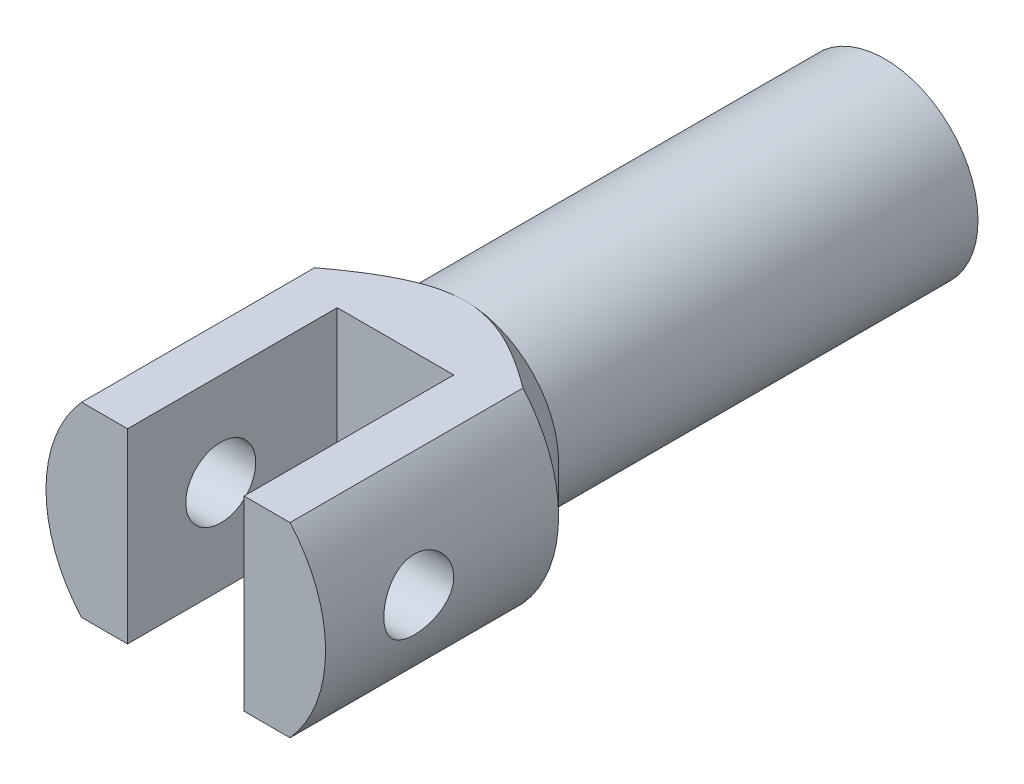
ISO-10303-21;
HEADER;
FILE_DESCRIPTION(('STEP AP214'),'2;1');
FILE_NAME('part.step','',(''),(''),'','','');
FILE_SCHEMA(('AUTOMOTIVE_DESIGN { 1 0 10303 214 1 1 1 1 }'));
ENDSEC;
DATA;
#1=APPLICATION_CONTEXT('core data for automotive mechanical design processes');
#2=APPLICATION_PROTOCOL_DEFINITION('international standard','automotive_design',2000,#1);
#3=PRODUCT_CONTEXT('',#1,'mechanical');
#4=PRODUCT('Part','Part','',(#3));
#5=PRODUCT_RELATED_PRODUCT_CATEGORY('part','',(#4));
#6=PRODUCT_DEFINITION_FORMATION('','',#4);
#7=PRODUCT_DEFINITION_CONTEXT('part definition',#1,'design');
#8=PRODUCT_DEFINITION('design','',#6,#7);
#9=PRODUCT_DEFINITION_SHAPE('','',#8);
#10=(LENGTH_UNIT() NAMED_UNIT(*) SI_UNIT(.MILLI.,.METRE.));
#11=(NAMED_UNIT(*) PLANE_ANGLE_UNIT() SI_UNIT($,.RADIAN.));
#12=(NAMED_UNIT(*) SI_UNIT($,.STERADIAN.) SOLID_ANGLE_UNIT());
#13=UNCERTAINTY_MEASURE_WITH_UNIT(LENGTH_MEASURE(1.E-05),#10,'distance_accuracy_value','');
#14=(GEOMETRIC_REPRESENTATION_CONTEXT(3) GLOBAL_UNCERTAINTY_ASSIGNED_CONTEXT((#13)) GLOBAL_UNIT_ASSIGNED_CONTEXT((#10,
#11,#12)) REPRESENTATION_CONTEXT('',''));
#15=CARTESIAN_POINT('',(0.,0.,0.));
#16=DIRECTION('',(0.,0.,1.));
#17=DIRECTION('',(1.,0.,0.));
#18=AXIS2_PLACEMENT_3D('',#15,#16,#17);
#19=CARTESIAN_POINT('',(0.,0.,30.));
#20=DIRECTION('',(0.,0.,1.));
#21=DIRECTION('',(1.,0.,0.));
#22=AXIS2_PLACEMENT_3D('',#19,#20,#21);
#23=PLANE('',#22);
#24=DIRECTION('',(-1.,0.,0.));
#25=VECTOR('',#24,1.);
#26=CARTESIAN_POINT('',(-4.47213595499958,4.,30.));
#27=LINE('',#26,#25);
#28=CARTESIAN_POINT('',(4.47213595499958,4.,30.));
#29=VERTEX_POINT('',#28);
#30=CARTESIAN_POINT('',(2.5,4.,30.));
#31=VERTEX_POINT('',#30);
#32=EDGE_CURVE('E181',#29,#31,#27,.T.);
#33=ORIENTED_EDGE('',*,*,#32,.T.);
#34=DIRECTION('',(0.,-1.,0.));
#35=VECTOR('',#34,1.);
#36=CARTESIAN_POINT('',(2.5,0.,30.));
#37=LINE('',#36,#35);
#38=CARTESIAN_POINT('',(2.5,-4.,30.));
#39=VERTEX_POINT('',#38);
#40=EDGE_CURVE('E274',#31,#39,#37,.T.);
#41=ORIENTED_EDGE('',*,*,#40,.T.);
#42=DIRECTION('',(1.,0.,0.));
#43=VECTOR('',#42,1.);
#44=CARTESIAN_POINT('',(-4.47213595499958,-4.,30.));
#45=LINE('',#44,#43);
#46=CARTESIAN_POINT('',(4.47213595499958,-4.,30.));
#47=VERTEX_POINT('',#46);
#48=EDGE_CURVE('E188',#39,#47,#45,.T.);
#49=ORIENTED_EDGE('',*,*,#48,.T.);
#50=CARTESIAN_POINT('',(0.,0.,30.));
#51=DIRECTION('',(0.,0.,1.));
#52=DIRECTION('',(1.,0.,0.));
#53=AXIS2_PLACEMENT_3D('',#50,#51,#52);
#54=CIRCLE('',#53,6.);
#55=EDGE_CURVE('E175',#47,#29,#54,.T.);
#56=ORIENTED_EDGE('',*,*,#55,.T.);
#57=EDGE_LOOP('',(#33,#41,#49,#56));
#58=FACE_BOUND('',#57,.T.);
#59=ADVANCED_FACE('F40',(#58),#23,.T.);
#60=CARTESIAN_POINT('',(0.,0.,20.));
#61=DIRECTION('',(0.,0.,-1.));
#62=DIRECTION('',(-1.,0.,0.));
#63=AXIS2_PLACEMENT_3D('',#60,#61,#62);
#64=CYLINDRICAL_SURFACE('',#63,4.);
#65=CARTESIAN_POINT('',(0.,0.,18.));
#66=DIRECTION('',(0.,0.,1.));
#67=DIRECTION('',(1.,0.,0.));
#68=AXIS2_PLACEMENT_3D('',#65,#66,#67);
#69=CIRCLE('',#68,4.);
#70=CARTESIAN_POINT('',(0.,4.,18.));
#71=VERTEX_POINT('',#70);
#72=CARTESIAN_POINT('',(0.,-4.,18.));
#73=VERTEX_POINT('',#72);
#74=EDGE_CURVE('E67',#71,#73,#69,.F.);
#75=ORIENTED_EDGE('',*,*,#74,.T.);
#76=CARTESIAN_POINT('',(0.,0.,18.));
#77=DIRECTION('',(0.,0.,1.));
#78=DIRECTION('',(1.,0.,0.));
#79=AXIS2_PLACEMENT_3D('',#76,#77,#78);
#80=CIRCLE('',#79,4.);
#81=EDGE_CURVE('E219',#73,#71,#80,.F.);
#82=ORIENTED_EDGE('',*,*,#81,.T.);
#83=EDGE_LOOP('',(#75,#82));
#84=FACE_BOUND('',#83,.T.);
#85=CARTESIAN_POINT('',(0.,0.,0.));
#86=DIRECTION('',(0.,0.,1.));
#87=DIRECTION('',(1.,0.,0.));
#88=AXIS2_PLACEMENT_3D('',#85,#86,#87);
#89=CIRCLE('',#88,4.);
#90=CARTESIAN_POINT('',(4.,0.,0.));
#91=VERTEX_POINT('',#90);
#92=EDGE_CURVE('E213',#91,#91,#89,.T.);
#93=ORIENTED_EDGE('',*,*,#92,.T.);
#94=EDGE_LOOP('',(#93));
#95=FACE_BOUND('',#94,.T.);
#96=ADVANCED_FACE('F244',(#84,#95),#64,.T.);
#97=CARTESIAN_POINT('',(0.,0.,0.));
#98=DIRECTION('',(0.,0.,1.));
#99=DIRECTION('',(1.,0.,0.));
#100=AXIS2_PLACEMENT_3D('',#97,#98,#99);
#101=PLANE('',#100);
#102=CARTESIAN_POINT('',(0.,0.,0.));
#103=DIRECTION('',(0.,0.,-1.));
#104=DIRECTION('',(-1.,0.,0.));
#105=AXIS2_PLACEMENT_3D('',#102,#103,#104);
#106=CIRCLE('',#105,1.99999999999999);
#107=CARTESIAN_POINT('',(-1.99999999999999,0.,0.));
#108=VERTEX_POINT('',#107);
#109=EDGE_CURVE('E303',#108,#108,#106,.T.);
#110=ORIENTED_EDGE('',*,*,#109,.F.);
#111=EDGE_LOOP('',(#110));
#112=FACE_BOUND('',#111,.T.);
#113=ORIENTED_EDGE('',*,*,#92,.F.);
#114=EDGE_LOOP('',(#113));
#115=FACE_BOUND('',#114,.T.);
#116=ADVANCED_FACE('F248',(#112,#115),#101,.F.);
#117=CARTESIAN_POINT('',(0.,0.,30.));
#118=DIRECTION('',(0.,0.,-1.));
#119=DIRECTION('',(-1.,0.,0.));
#120=AXIS2_PLACEMENT_3D('',#117,#118,#119);
#121=CYLINDRICAL_SURFACE('',#120,6.);
#122=CARTESIAN_POINT('',(6.,0.,27.5));
#123=CARTESIAN_POINT('',(5.99999859868013,0.0828760886697307,27.4999976742618));
#124=CARTESIAN_POINT('',(5.99826578131828,0.165778157830762,27.4931084492262));
#125=CARTESIAN_POINT('',(5.99152113829892,0.329206323770531,27.465774848693));
#126=CARTESIAN_POINT('',(5.98650745419968,0.409731046870738,27.4453227904621));
#127=CARTESIAN_POINT('',(5.9737562633204,0.566020872182575,27.3915607465379));
#128=CARTESIAN_POINT('',(5.96602202842087,0.641791563430001,27.3582662012847));
#129=CARTESIAN_POINT('',(5.94865343807593,0.786672131904423,27.2798186099552));
#130=CARTESIAN_POINT('',(5.9390190185405,0.855781784348756,27.2346651638811));
#131=CARTESIAN_POINT('',(5.91867413591801,0.986801927300917,27.1327992103458));
#132=CARTESIAN_POINT('',(5.90794707148533,1.04855569006107,27.0758884250408));
#133=CARTESIAN_POINT('',(5.8867362011753,1.1617489272033,26.9525477950911));
#134=CARTESIAN_POINT('',(5.87625242288348,1.21318723694913,26.8861168770535));
#135=CARTESIAN_POINT('',(5.8565477569971,1.30502654279903,26.7444047732626));
#136=CARTESIAN_POINT('',(5.84734794470605,1.34525221592535,26.6690067691896));
#137=CARTESIAN_POINT('',(5.83149494812223,1.41239690855052,26.5122515883416));
#138=CARTESIAN_POINT('',(5.82484135672789,1.43931805543933,26.4308953666742));
#139=CARTESIAN_POINT('',(5.81500476717551,1.47855483680428,26.2662565017975));
#140=CARTESIAN_POINT('',(5.81175491075426,1.49115226833333,26.1830451039502));
#141=CARTESIAN_POINT('',(5.80889362537741,1.50226177506785,26.015631430986));
#142=CARTESIAN_POINT('',(5.80928160448644,1.50077614181797,25.9314293193014));
#143=CARTESIAN_POINT('',(5.81359205496618,1.48398652463927,25.7665841922555));
#144=CARTESIAN_POINT('',(5.81742863001879,1.46901834019051,25.6859043785349));
#145=CARTESIAN_POINT('',(5.82806709676484,1.4262241869031,25.5282389490887));
#146=CARTESIAN_POINT('',(5.83486919970697,1.39839730206942,25.451253596971));
#147=CARTESIAN_POINT('',(5.85075113904187,1.33038947793715,25.3022619837479));
#148=CARTESIAN_POINT('',(5.85985327469421,1.29008666723291,25.2303138282104));
#149=CARTESIAN_POINT('',(5.87929710846386,1.19835627601495,25.0940812902432));
#150=CARTESIAN_POINT('',(5.88963902334735,1.14692674880883,25.0297982519327));
#151=CARTESIAN_POINT('',(5.91075880539781,1.03266342468121,24.9087963843056));
#152=CARTESIAN_POINT('',(5.92154069477971,0.969546258165857,24.8523455099387));
#153=CARTESIAN_POINT('',(5.94205965578786,0.834611917503699,24.7507787575361));
#154=CARTESIAN_POINT('',(5.95179669549415,0.762794477707943,24.7056632257364));
#155=CARTESIAN_POINT('',(5.96917732094182,0.612115888681392,24.6279494137756));
#156=CARTESIAN_POINT('',(5.97681360127725,0.533231393208624,24.5953946597456));
#157=CARTESIAN_POINT('',(5.98907916991419,0.370876008142883,24.5440826942904));
#158=CARTESIAN_POINT('',(5.99370903339281,0.287405999150484,24.5253228435819));
#159=CARTESIAN_POINT('',(5.99935499271375,0.120539970390026,24.5025424344412));
#160=CARTESIAN_POINT('',(6.00046053508279,0.0371967199882093,24.4981569739247));
#161=CARTESIAN_POINT('',(5.99918804814451,-0.129032874801508,24.5032490020555));
#162=CARTESIAN_POINT('',(5.99681033241846,-0.211919259644595,24.5127252427991));
#163=CARTESIAN_POINT('',(5.98889581127357,-0.373614268776491,24.5449709083914));
#164=CARTESIAN_POINT('',(5.98340634185811,-0.452465118968754,24.567541263477));
#165=CARTESIAN_POINT('',(5.96988706634134,-0.605257292452509,24.6251070840285));
#166=CARTESIAN_POINT('',(5.96185700369892,-0.679198119032632,24.6601038043132));
#167=CARTESIAN_POINT('',(5.9439330792631,-0.821523134429844,24.7422361288747));
#168=CARTESIAN_POINT('',(5.93400867366932,-0.889785441835827,24.7895761123968));
#169=CARTESIAN_POINT('',(5.91344509187419,-1.01752661364324,24.894789908797));
#170=CARTESIAN_POINT('',(5.90280579251705,-1.077003958973,24.9526655396169));
#171=CARTESIAN_POINT('',(5.88168956960771,-1.18699056807273,25.0790019608445));
#172=CARTESIAN_POINT('',(5.87122304187281,-1.23724386762203,25.1476877030024));
#173=CARTESIAN_POINT('',(5.85192878377239,-1.32551075901269,25.2927326344657));
#174=CARTESIAN_POINT('',(5.84310098067026,-1.36352489415793,25.3690914829598));
#175=CARTESIAN_POINT('',(5.82818094734665,-1.42595142060929,25.5269057224131));
#176=CARTESIAN_POINT('',(5.82207255291906,-1.45044439665406,25.608327628344));
#177=CARTESIAN_POINT('',(5.81326744090184,-1.48534565995377,25.7743096378891));
#178=CARTESIAN_POINT('',(5.81056997719936,-1.49575702747865,25.8588690510325));
#179=CARTESIAN_POINT('',(5.80894901203957,-1.50203859033399,26.0261210238552));
#180=CARTESIAN_POINT('',(5.80991932728264,-1.49831789778011,26.1087974351247));
#181=CARTESIAN_POINT('',(5.81527909007843,-1.47737727831286,26.272303888668));
#182=CARTESIAN_POINT('',(5.81966846891857,-1.46015762268676,26.3531339680136));
#183=CARTESIAN_POINT('',(5.83131260682723,-1.41293131944279,26.5102084590654));
#184=CARTESIAN_POINT('',(5.8385501523631,-1.38300140468037,26.5864773052402));
#185=CARTESIAN_POINT('',(5.85507755724829,-1.31126491360507,26.7329653827137));
#186=CARTESIAN_POINT('',(5.86436770120773,-1.26945669003418,26.8031837731869));
#187=CARTESIAN_POINT('',(5.88425634263512,-1.17386774863713,26.937554629002));
#188=CARTESIAN_POINT('',(5.89488264831757,-1.11980316291225,27.001501073424));
#189=CARTESIAN_POINT('',(5.91608027246286,-1.00178937118973,27.1195470447954));
#190=CARTESIAN_POINT('',(5.9266515772706,-0.937837821261141,27.173644230113));
#191=CARTESIAN_POINT('',(5.94677655647663,-0.800467586702586,27.2714113085646));
#192=CARTESIAN_POINT('',(5.95630833365868,-0.726898422316383,27.3148746136716));
#193=CARTESIAN_POINT('',(5.97304924975118,-0.573266059510474,27.3887474629405));
#194=CARTESIAN_POINT('',(5.98026005199781,-0.493207563436737,27.4191663606485));
#195=CARTESIAN_POINT('',(5.99048059565542,-0.34441025324347,27.4615718303296));
#196=CARTESIAN_POINT('',(5.99402585052691,-0.276380170908067,27.4759512430534));
#197=CARTESIAN_POINT('',(5.99878605231948,-0.138906071536282,27.4951659436219));
#198=CARTESIAN_POINT('',(6.00000117450894,-0.0694621612426158,27.5000019493053));
#199=CARTESIAN_POINT('',(6.,0.,27.5));
#200=B_SPLINE_CURVE_WITH_KNOTS('',3,(#122,#123,#124,#125,#126,#127,#128,#129,#130,#131,#132,
#133,#134,#135,#136,#137,#138,#139,#140,#141,#142,#143,#144,#145,#146,#147,#148,#149,#150,#151,
#152,#153,#154,#155,#156,#157,#158,#159,#160,#161,#162,#163,#164,#165,#166,#167,#168,#169,#170,
#171,#172,#173,#174,#175,#176,#177,#178,#179,#180,#181,#182,#183,#184,#185,#186,#187,#188,#189,
#190,#191,#192,#193,#194,#195,#196,#197,#198,#199),.UNSPECIFIED.,.T.,.F.,(4,2,2,2,2,2,2,2,2,2,2,
2,2,2,2,2,2,2,2,2,2,2,2,2,2,2,2,2,2,2,2,2,2,2,2,2,2,2,4),(0.,0.248373712471889,
0.496888237763898,0.745104902286104,0.993329940169325,1.24614435437139,1.49898729580061,
1.75558647545806,2.01214461169368,2.2635629509943,2.51494038112695,2.76022497007016,
3.00552703466037,3.25330527873878,3.50112690836161,3.75601500969017,4.01091089558245,
4.26668229009112,4.52240473688641,4.77158308949274,5.02073901112741,5.26620274514035,
5.51169127322288,5.76153587565349,6.01142363008016,6.26744509204473,6.52345518749505,
6.77792254614033,7.03233423252405,7.2794378039861,7.52653640956031,7.77216400559443,
8.01782568136897,8.26989576409906,8.52202569770414,8.77872185499584,9.03523363821346,
9.24342242942145,9.45159556043035),.UNSPECIFIED.);
#201=CARTESIAN_POINT('',(6.,0.,27.5));
#202=VERTEX_POINT('',#201);
#203=EDGE_CURVE('E333',#202,#202,#200,.T.);
#204=ORIENTED_EDGE('',*,*,#203,.T.);
#205=EDGE_LOOP('',(#204));
#206=FACE_BOUND('',#205,.T.);
#207=CARTESIAN_POINT('',(0.,0.,20.));
#208=DIRECTION('',(0.,0.,1.));
#209=DIRECTION('',(1.,0.,0.));
#210=AXIS2_PLACEMENT_3D('',#207,#208,#209);
#211=CIRCLE('',#210,6.);
#212=CARTESIAN_POINT('',(4.47213595499958,-4.,20.));
#213=VERTEX_POINT('',#212);
#214=CARTESIAN_POINT('',(4.47213595499958,4.,20.));
#215=VERTEX_POINT('',#214);
#216=EDGE_CURVE('E174',#213,#215,#211,.T.);
#217=ORIENTED_EDGE('',*,*,#216,.T.);
#218=DIRECTION('',(0.,0.,-1.));
#219=VECTOR('',#218,1.);
#220=CARTESIAN_POINT('',(4.47213595499958,4.,30.));
#221=LINE('',#220,#219);
#222=EDGE_CURVE('E210',#29,#215,#221,.T.);
#223=ORIENTED_EDGE('',*,*,#222,.F.);
#224=ORIENTED_EDGE('',*,*,#55,.F.);
#225=DIRECTION('',(0.,0.,-1.));
#226=VECTOR('',#225,1.);
#227=CARTESIAN_POINT('',(4.47213595499958,-4.,30.));
#228=LINE('',#227,#226);
#229=EDGE_CURVE('E193',#47,#213,#228,.T.);
#230=ORIENTED_EDGE('',*,*,#229,.T.);
#231=EDGE_LOOP('',(#217,#223,#224,#230));
#232=FACE_BOUND('',#231,.T.);
#233=ADVANCED_FACE('F251',(#206,#232),#121,.T.);
#234=CARTESIAN_POINT('',(-4.47213595499958,4.,30.));
#235=DIRECTION('',(0.,-1.,0.));
#236=DIRECTION('',(0.,0.,-1.));
#237=AXIS2_PLACEMENT_3D('',#234,#235,#236);
#238=PLANE('',#237);
#239=CARTESIAN_POINT('',(-2.5,4.,30.));
#240=VERTEX_POINT('',#239);
#241=CARTESIAN_POINT('',(-4.47213595499958,4.,30.));
#242=VERTEX_POINT('',#241);
#243=EDGE_CURVE('E179',#240,#242,#27,.T.);
#244=ORIENTED_EDGE('',*,*,#243,.F.);
#245=DIRECTION('',(0.,0.,-1.));
#246=VECTOR('',#245,1.);
#247=CARTESIAN_POINT('',(-2.5,4.,30.));
#248=LINE('',#247,#246);
#249=CARTESIAN_POINT('',(-2.5,4.,21.));
#250=VERTEX_POINT('',#249);
#251=EDGE_CURVE('E167',#240,#250,#248,.T.);
#252=ORIENTED_EDGE('',*,*,#251,.T.);
#253=DIRECTION('',(-1.,0.,0.));
#254=VECTOR('',#253,1.);
#255=CARTESIAN_POINT('',(-4.47213595499958,4.,21.));
#256=LINE('',#255,#254);
#257=CARTESIAN_POINT('',(2.5,4.,21.));
#258=VERTEX_POINT('',#257);
#259=EDGE_CURVE('E171',#258,#250,#256,.T.);
#260=ORIENTED_EDGE('',*,*,#259,.F.);
#261=DIRECTION('',(0.,0.,-1.));
#262=VECTOR('',#261,1.);
#263=CARTESIAN_POINT('',(2.5,4.,30.));
#264=LINE('',#263,#262);
#265=EDGE_CURVE('E160',#31,#258,#264,.T.);
#266=ORIENTED_EDGE('',*,*,#265,.F.);
#267=ORIENTED_EDGE('',*,*,#32,.F.);
#268=ORIENTED_EDGE('',*,*,#222,.T.);
#269=CARTESIAN_POINT('',(4.47213595499959,4.00000000000001,20.));
#270=CARTESIAN_POINT('',(4.35142333142334,4.,19.910054370761));
#271=CARTESIAN_POINT('',(4.22995080731032,4.,19.821106832145));
#272=CARTESIAN_POINT('',(3.98514499474686,4.,19.6457061049216));
#273=CARTESIAN_POINT('',(3.86181096179426,4.,19.5592539568776));
#274=CARTESIAN_POINT('',(3.6117594834214,4.,19.3885428401963));
#275=CARTESIAN_POINT('',(3.48502027813808,4.,19.3043156105058));
#276=CARTESIAN_POINT('',(3.22904783281085,4.,19.1397597720087));
#277=CARTESIAN_POINT('',(3.09981492152281,4.,19.0594306541393));
#278=CARTESIAN_POINT('',(2.84446280978705,4.,18.9072344931623));
#279=CARTESIAN_POINT('',(2.71847503943778,4.,18.835148025789));
#280=CARTESIAN_POINT('',(2.46344504297861,4.,18.6964990374887));
#281=CARTESIAN_POINT('',(2.33440227854241,4.,18.6299374995726));
#282=CARTESIAN_POINT('',(2.07344881982375,4.,18.5040184393953));
#283=CARTESIAN_POINT('',(1.94155145761114,4.,18.4446335163658));
#284=CARTESIAN_POINT('',(1.67419930205705,4.,18.3345266681242));
#285=CARTESIAN_POINT('',(1.53874592771493,4.,18.2838013462138));
#286=CARTESIAN_POINT('',(1.28956835551813,4.,18.2014086070677));
#287=CARTESIAN_POINT('',(1.17643963056331,4.,18.1679517883228));
#288=CARTESIAN_POINT('',(0.948044256758145,4.,18.1093322922515));
#289=CARTESIAN_POINT('',(0.832777860504119,4.,18.0841686414824));
#290=CARTESIAN_POINT('',(0.598522943057024,4.,18.0428614916986));
#291=CARTESIAN_POINT('',(0.479504570413497,4.,18.0268830805361));
#292=CARTESIAN_POINT('',(0.300192604519243,4.,18.0108045067625));
#293=CARTESIAN_POINT('',(0.24023359676465,4.,18.0067597414144));
#294=CARTESIAN_POINT('',(0.120185908174825,4.,18.0013550315828));
#295=CARTESIAN_POINT('',(0.0600972091343572,4.,17.9999954924003));
#296=CARTESIAN_POINT('',(0.,4.,18.));
#297=B_SPLINE_CURVE_WITH_KNOTS('',3,(#269,#270,#271,#272,#273,#274,#275,#276,#277,#278,#279,
#280,#281,#282,#283,#284,#285,#286,#287,#288,#289,#290,#291,#292,#293,#294,#295,#296),
.UNSPECIFIED.,.F.,.F.,(4,2,2,2,2,2,2,2,2,2,2,2,2,4),(0.,0.45162883698991,0.90344335685351,
1.35990900686355,1.81631488473456,2.2516636030522,2.68708961454308,3.12079677346839,
3.55433341943443,3.90798026404445,4.26158558319029,4.62136216571588,4.80159491891547,
4.98185487389596),.UNSPECIFIED.);
#298=EDGE_CURVE('E261',#215,#71,#297,.T.);
#299=ORIENTED_EDGE('',*,*,#298,.T.);
#300=CARTESIAN_POINT('',(0.,4.,18.));
#301=CARTESIAN_POINT('',(-0.0615144227645808,4.,17.9999950400238));
#302=CARTESIAN_POINT('',(-0.123019703550323,4.,18.0014197177209));
#303=CARTESIAN_POINT('',(-0.245890826341455,4.,18.0070817011832));
#304=CARTESIAN_POINT('',(-0.307256689649331,4.,18.0113185435443));
#305=CARTESIAN_POINT('',(-0.49073796162968,4.,18.0281546003415));
#306=CARTESIAN_POINT('',(-0.612494998021421,4.,18.0448797356666));
#307=CARTESIAN_POINT('',(-0.852037534189965,4.,18.0880688161789));
#308=CARTESIAN_POINT('',(-0.969855281370963,4.,18.1143584711274));
#309=CARTESIAN_POINT('',(-1.20323488435296,4.,18.1755342197758));
#310=CARTESIAN_POINT('',(-1.31879632550585,4.,18.210421877804));
#311=CARTESIAN_POINT('',(-1.56886117344786,4.,18.2947621224319));
#312=CARTESIAN_POINT('',(-1.70285339622145,4.,18.3457191197222));
#313=CARTESIAN_POINT('',(-1.96735495487635,4.,18.4560096497589));
#314=CARTESIAN_POINT('',(-2.09786299269077,4.,18.5153462540221));
#315=CARTESIAN_POINT('',(-2.35608068719794,4.,18.6409419743433));
#316=CARTESIAN_POINT('',(-2.48377807039459,4.,18.7072261198141));
#317=CARTESIAN_POINT('',(-2.73619219087517,4.,18.8451604682077));
#318=CARTESIAN_POINT('',(-2.86090942640452,4.,18.9168097657424));
#319=CARTESIAN_POINT('',(-3.11360348671611,4.,19.0679176931365));
#320=CARTESIAN_POINT('',(-3.24145461990816,4.,19.1475855049601));
#321=CARTESIAN_POINT('',(-3.49472347666949,4.,19.3107171941503));
#322=CARTESIAN_POINT('',(-3.62014089286898,4.,19.3941815466121));
#323=CARTESIAN_POINT('',(-3.86767323567841,4.,19.5633437216018));
#324=CARTESIAN_POINT('',(-3.98980838511972,4.,19.6490120740395));
#325=CARTESIAN_POINT('',(-4.23225582676266,4.,19.8227942270249));
#326=CARTESIAN_POINT('',(-4.35256881949239,4.,19.910907048901));
#327=CARTESIAN_POINT('',(-4.47213595499959,4.,20.));
#328=B_SPLINE_CURVE_WITH_KNOTS('',3,(#300,#301,#302,#303,#304,#305,#306,#307,#308,#309,#310,
#311,#312,#313,#314,#315,#316,#317,#318,#319,#320,#321,#322,#323,#324,#325,#326,#327),
.UNSPECIFIED.,.F.,.F.,(4,2,2,2,2,2,2,2,2,2,2,2,2,4),(0.,0.184509301564299,0.368988206215191,
0.737175096712423,1.09896369623891,1.46081816856319,1.89052177339546,2.32038329544043,
2.75185045577596,3.18324496791556,3.63508689605363,4.0869855236103,4.53450633451786,
4.98185048989545),.UNSPECIFIED.);
#329=CARTESIAN_POINT('',(-4.47213595499958,4.,20.));
#330=VERTEX_POINT('',#329);
#331=EDGE_CURVE('E228',#71,#330,#328,.T.);
#332=ORIENTED_EDGE('',*,*,#331,.T.);
#333=DIRECTION('',(0.,0.,-1.));
#334=VECTOR('',#333,1.);
#335=CARTESIAN_POINT('',(-4.47213595499958,4.,30.));
#336=LINE('',#335,#334);
#337=EDGE_CURVE('E206',#242,#330,#336,.T.);
#338=ORIENTED_EDGE('',*,*,#337,.F.);
#339=EDGE_LOOP('',(#244,#252,#260,#266,#267,#268,#299,#332,#338));
#340=FACE_BOUND('',#339,.T.);
#341=ADVANCED_FACE('F254',(#340),#238,.F.);
#342=CARTESIAN_POINT('',(0.,0.,30.));
#343=DIRECTION('',(0.,0.,-1.));
#344=DIRECTION('',(-1.,0.,0.));
#345=AXIS2_PLACEMENT_3D('',#342,#343,#344);
#346=CYLINDRICAL_SURFACE('',#345,6.);
#347=CARTESIAN_POINT('',(-6.,0.,24.5));
#348=CARTESIAN_POINT('',(-5.99999859868013,0.0828760886697305,24.5000023257382));
#349=CARTESIAN_POINT('',(-5.99826578131828,0.165778157830762,24.5068915507738));
#350=CARTESIAN_POINT('',(-5.99152113829892,0.329206323770531,24.534225151307));
#351=CARTESIAN_POINT('',(-5.98650745419968,0.409731046870738,24.5546772095379));
#352=CARTESIAN_POINT('',(-5.9737562633204,0.566020872182575,24.6084392534621));
#353=CARTESIAN_POINT('',(-5.96602202842087,0.641791563430001,24.6417337987153));
#354=CARTESIAN_POINT('',(-5.94865343807593,0.786672131904423,24.7201813900448));
#355=CARTESIAN_POINT('',(-5.9390190185405,0.855781784348756,24.7653348361189));
#356=CARTESIAN_POINT('',(-5.91867413591801,0.986801927300917,24.8672007896542));
#357=CARTESIAN_POINT('',(-5.90794707148533,1.04855569006107,24.9241115749592));
#358=CARTESIAN_POINT('',(-5.8867362011753,1.1617489272033,25.0474522049089));
#359=CARTESIAN_POINT('',(-5.87625242288348,1.21318723694913,25.1138831229465));
#360=CARTESIAN_POINT('',(-5.8565477569971,1.30502654279903,25.2555952267374));
#361=CARTESIAN_POINT('',(-5.84734794470605,1.34525221592535,25.3309932308104));
#362=CARTESIAN_POINT('',(-5.83149494812223,1.41239690855052,25.4877484116584));
#363=CARTESIAN_POINT('',(-5.82484135672789,1.43931805543933,25.5691046333258));
#364=CARTESIAN_POINT('',(-5.81500476717551,1.47855483680428,25.7337434982025));
#365=CARTESIAN_POINT('',(-5.81175491075426,1.49115226833333,25.8169548960498));
#366=CARTESIAN_POINT('',(-5.80889362537741,1.50226177506784,25.984368569014));
#367=CARTESIAN_POINT('',(-5.80928160448644,1.50077614181797,26.0685706806986));
#368=CARTESIAN_POINT('',(-5.81359205496618,1.48398652463927,26.2334158077445));
#369=CARTESIAN_POINT('',(-5.81742863001879,1.46901834019051,26.3140956214651));
#370=CARTESIAN_POINT('',(-5.82806709676484,1.4262241869031,26.4717610509113));
#371=CARTESIAN_POINT('',(-5.83486919970697,1.39839730206942,26.548746403029));
#372=CARTESIAN_POINT('',(-5.85075113904187,1.33038947793715,26.6977380162521));
#373=CARTESIAN_POINT('',(-5.85985327469421,1.29008666723291,26.7696861717895));
#374=CARTESIAN_POINT('',(-5.87929710846386,1.19835627601495,26.9059187097568));
#375=CARTESIAN_POINT('',(-5.88963902334735,1.14692674880883,26.9702017480672));
#376=CARTESIAN_POINT('',(-5.91075880539781,1.03266342468121,27.0912036156944));
#377=CARTESIAN_POINT('',(-5.92154069477971,0.969546258165857,27.1476544900613));
#378=CARTESIAN_POINT('',(-5.94205965578786,0.834611917503698,27.2492212424639));
#379=CARTESIAN_POINT('',(-5.95179669549415,0.762794477707942,27.2943367742636));
#380=CARTESIAN_POINT('',(-5.96917732094182,0.612115888681391,27.3720505862244));
#381=CARTESIAN_POINT('',(-5.97681360127725,0.533231393208622,27.4046053402544));
#382=CARTESIAN_POINT('',(-5.98907916991419,0.370876008142882,27.4559173057096));
#383=CARTESIAN_POINT('',(-5.99370903339281,0.287405999150484,27.4746771564181));
#384=CARTESIAN_POINT('',(-5.99935499271375,0.120539970390026,27.4974575655588));
#385=CARTESIAN_POINT('',(-6.00046053508279,0.0371967199882092,27.5018430260753));
#386=CARTESIAN_POINT('',(-5.99918804814451,-0.129032874801508,27.4967509979445));
#387=CARTESIAN_POINT('',(-5.99681033241846,-0.211919259644595,27.4872747572009));
#388=CARTESIAN_POINT('',(-5.98889581127357,-0.373614268776491,27.4550290916086));
#389=CARTESIAN_POINT('',(-5.98340634185811,-0.452465118968753,27.432458736523));
#390=CARTESIAN_POINT('',(-5.96988706634134,-0.605257292452509,27.3748929159715));
#391=CARTESIAN_POINT('',(-5.96185700369892,-0.679198119032632,27.3398961956868));
#392=CARTESIAN_POINT('',(-5.9439330792631,-0.821523134429844,27.2577638711253));
#393=CARTESIAN_POINT('',(-5.93400867366932,-0.889785441835827,27.2104238876032));
#394=CARTESIAN_POINT('',(-5.91344509187419,-1.01752661364324,27.105210091203));
#395=CARTESIAN_POINT('',(-5.90280579251705,-1.077003958973,27.0473344603831));
#396=CARTESIAN_POINT('',(-5.88168956960771,-1.18699056807272,26.9209980391555));
#397=CARTESIAN_POINT('',(-5.87122304187281,-1.23724386762203,26.8523122969976));
#398=CARTESIAN_POINT('',(-5.85192878377239,-1.32551075901269,26.7072673655343));
#399=CARTESIAN_POINT('',(-5.84310098067026,-1.36352489415793,26.6309085170402));
#400=CARTESIAN_POINT('',(-5.82818094734665,-1.42595142060929,26.4730942775869));
#401=CARTESIAN_POINT('',(-5.82207255291906,-1.45044439665406,26.391672371656));
#402=CARTESIAN_POINT('',(-5.81326744090184,-1.48534565995377,26.2256903621109));
#403=CARTESIAN_POINT('',(-5.81056997719936,-1.49575702747865,26.1411309489675));
#404=CARTESIAN_POINT('',(-5.80894901203957,-1.50203859033399,25.9738789761448));
#405=CARTESIAN_POINT('',(-5.80991932728264,-1.49831789778011,25.8912025648753));
#406=CARTESIAN_POINT('',(-5.81527909007843,-1.47737727831286,25.727696111332));
#407=CARTESIAN_POINT('',(-5.81966846891857,-1.46015762268676,25.6468660319863));
#408=CARTESIAN_POINT('',(-5.83131260682723,-1.41293131944279,25.4897915409346));
#409=CARTESIAN_POINT('',(-5.8385501523631,-1.38300140468037,25.4135226947598));
#410=CARTESIAN_POINT('',(-5.85507755724829,-1.31126491360507,25.2670346172863));
#411=CARTESIAN_POINT('',(-5.86436770120773,-1.26945669003418,25.1968162268131));
#412=CARTESIAN_POINT('',(-5.88425634263512,-1.17386774863713,25.062445370998));
#413=CARTESIAN_POINT('',(-5.89488264831757,-1.11980316291225,24.998498926576));
#414=CARTESIAN_POINT('',(-5.91608027246286,-1.00178937118973,24.8804529552046));
#415=CARTESIAN_POINT('',(-5.9266515772706,-0.93783782126114,24.826355769887));
#416=CARTESIAN_POINT('',(-5.94677655647663,-0.800467586702587,24.7285886914354));
#417=CARTESIAN_POINT('',(-5.95630833365868,-0.726898422316385,24.6851253863284));
#418=CARTESIAN_POINT('',(-5.97304924975118,-0.573266059510476,24.6112525370595));
#419=CARTESIAN_POINT('',(-5.98026005199781,-0.493207563436738,24.5808336393515));
#420=CARTESIAN_POINT('',(-5.99048059565542,-0.34441025324347,24.5384281696704));
#421=CARTESIAN_POINT('',(-5.99402585052691,-0.276380170908067,24.5240487569466));
#422=CARTESIAN_POINT('',(-5.99878605231948,-0.138906071536282,24.5048340563781));
#423=CARTESIAN_POINT('',(-6.00000117450894,-0.0694621612426158,24.4999980506947));
#424=CARTESIAN_POINT('',(-6.,0.,24.5));
#425=B_SPLINE_CURVE_WITH_KNOTS('',3,(#347,#348,#349,#350,#351,#352,#353,#354,#355,#356,#357,
#358,#359,#360,#361,#362,#363,#364,#365,#366,#367,#368,#369,#370,#371,#372,#373,#374,#375,#376,
#377,#378,#379,#380,#381,#382,#383,#384,#385,#386,#387,#388,#389,#390,#391,#392,#393,#394,#395,
#396,#397,#398,#399,#400,#401,#402,#403,#404,#405,#406,#407,#408,#409,#410,#411,#412,#413,#414,
#415,#416,#417,#418,#419,#420,#421,#422,#423,#424),.UNSPECIFIED.,.T.,.F.,(4,2,2,2,2,2,2,2,2,2,2,
2,2,2,2,2,2,2,2,2,2,2,2,2,2,2,2,2,2,2,2,2,2,2,2,2,2,2,4),(0.,0.248373712471888,
0.496888237763898,0.745104902286104,0.993329940169325,1.24614435437139,1.49898729580061,
1.75558647545806,2.01214461169368,2.26356295099429,2.51494038112695,2.76022497007016,
3.00552703466037,3.25330527873878,3.50112690836161,3.75601500969018,4.01091089558245,
4.26668229009112,4.52240473688641,4.77158308949274,5.02073901112741,5.26620274514035,
5.51169127322288,5.7615358756535,6.01142363008016,6.26744509204473,6.52345518749505,
6.77792254614034,7.03233423252405,7.2794378039861,7.52653640956031,7.77216400559444,
8.01782568136897,8.26989576409907,8.52202569770414,8.77872185499584,9.03523363821346,
9.24342242942145,9.45159556043036),.UNSPECIFIED.);
#426=CARTESIAN_POINT('',(-6.,0.,24.5));
#427=VERTEX_POINT('',#426);
#428=EDGE_CURVE('E305',#427,#427,#425,.T.);
#429=ORIENTED_EDGE('',*,*,#428,.T.);
#430=EDGE_LOOP('',(#429));
#431=FACE_BOUND('',#430,.T.);
#432=CARTESIAN_POINT('',(0.,0.,20.));
#433=DIRECTION('',(0.,0.,1.));
#434=DIRECTION('',(1.,0.,0.));
#435=AXIS2_PLACEMENT_3D('',#432,#433,#434);
#436=CIRCLE('',#435,6.);
#437=CARTESIAN_POINT('',(-4.47213595499958,-4.,20.));
#438=VERTEX_POINT('',#437);
#439=EDGE_CURVE('E180',#330,#438,#436,.T.);
#440=ORIENTED_EDGE('',*,*,#439,.T.);
#441=DIRECTION('',(0.,0.,-1.));
#442=VECTOR('',#441,1.);
#443=CARTESIAN_POINT('',(-4.47213595499958,-4.,30.));
#444=LINE('',#443,#442);
#445=CARTESIAN_POINT('',(-4.47213595499958,-4.,30.));
#446=VERTEX_POINT('',#445);
#447=EDGE_CURVE('E202',#446,#438,#444,.T.);
#448=ORIENTED_EDGE('',*,*,#447,.F.);
#449=CARTESIAN_POINT('',(0.,0.,30.));
#450=DIRECTION('',(0.,0.,1.));
#451=DIRECTION('',(1.,0.,0.));
#452=AXIS2_PLACEMENT_3D('',#449,#450,#451);
#453=CIRCLE('',#452,6.);
#454=EDGE_CURVE('E185',#242,#446,#453,.T.);
#455=ORIENTED_EDGE('',*,*,#454,.F.);
#456=ORIENTED_EDGE('',*,*,#337,.T.);
#457=EDGE_LOOP('',(#440,#448,#455,#456));
#458=FACE_BOUND('',#457,.T.);
#459=ADVANCED_FACE('F258',(#431,#458),#346,.T.);
#460=CARTESIAN_POINT('',(-4.47213595499958,-4.,30.));
#461=DIRECTION('',(0.,1.,0.));
#462=DIRECTION('',(0.,0.,1.));
#463=AXIS2_PLACEMENT_3D('',#460,#461,#462);
#464=PLANE('',#463);
#465=DIRECTION('',(1.,0.,0.));
#466=VECTOR('',#465,1.);
#467=CARTESIAN_POINT('',(-4.47213595499958,-4.,21.));
#468=LINE('',#467,#466);
#469=CARTESIAN_POINT('',(-2.5,-4.,21.));
#470=VERTEX_POINT('',#469);
#471=CARTESIAN_POINT('',(2.5,-4.,21.));
#472=VERTEX_POINT('',#471);
#473=EDGE_CURVE('E11',#470,#472,#468,.T.);
#474=ORIENTED_EDGE('',*,*,#473,.F.);
#475=DIRECTION('',(0.,0.,1.));
#476=VECTOR('',#475,1.);
#477=CARTESIAN_POINT('',(-2.5,-4.,30.));
#478=LINE('',#477,#476);
#479=CARTESIAN_POINT('',(-2.5,-4.,30.));
#480=VERTEX_POINT('',#479);
#481=EDGE_CURVE('E163',#470,#480,#478,.T.);
#482=ORIENTED_EDGE('',*,*,#481,.T.);
#483=EDGE_CURVE('E189',#446,#480,#45,.T.);
#484=ORIENTED_EDGE('',*,*,#483,.F.);
#485=ORIENTED_EDGE('',*,*,#447,.T.);
#486=CARTESIAN_POINT('',(-4.47213595499959,-4.00000000000001,20.));
#487=CARTESIAN_POINT('',(-4.35142333142335,-4.,19.910054370761));
#488=CARTESIAN_POINT('',(-4.22995080731032,-4.,19.821106832145));
#489=CARTESIAN_POINT('',(-3.98514499474687,-4.,19.6457061049216));
#490=CARTESIAN_POINT('',(-3.86181096179426,-4.,19.5592539568776));
#491=CARTESIAN_POINT('',(-3.6117594834214,-4.,19.3885428401963));
#492=CARTESIAN_POINT('',(-3.48502027813808,-4.,19.3043156105058));
#493=CARTESIAN_POINT('',(-3.22904783281085,-4.,19.1397597720087));
#494=CARTESIAN_POINT('',(-3.09981492152281,-4.,19.0594306541393));
#495=CARTESIAN_POINT('',(-2.84446280978706,-4.,18.9072344931623));
#496=CARTESIAN_POINT('',(-2.71847503943778,-4.,18.835148025789));
#497=CARTESIAN_POINT('',(-2.46344504297861,-4.,18.6964990374887));
#498=CARTESIAN_POINT('',(-2.33440227854242,-4.,18.6299374995726));
#499=CARTESIAN_POINT('',(-2.07344881982376,-4.,18.5040184393953));
#500=CARTESIAN_POINT('',(-1.94155145761115,-4.,18.4446335163658));
#501=CARTESIAN_POINT('',(-1.67419930205705,-4.,18.3345266681242));
#502=CARTESIAN_POINT('',(-1.53874592771493,-4.,18.2838013462138));
#503=CARTESIAN_POINT('',(-1.28956835551813,-4.,18.2014086070677));
#504=CARTESIAN_POINT('',(-1.17643963056331,-4.,18.1679517883228));
#505=CARTESIAN_POINT('',(-0.948044256758147,-4.,18.1093322922515));
#506=CARTESIAN_POINT('',(-0.832777860504121,-4.,18.0841686414824));
#507=CARTESIAN_POINT('',(-0.598522943057026,-4.,18.0428614916986));
#508=CARTESIAN_POINT('',(-0.479504570413499,-4.,18.0268830805361));
#509=CARTESIAN_POINT('',(-0.300192604519246,-4.,18.0108045067625));
#510=CARTESIAN_POINT('',(-0.240233596764652,-4.,18.0067597414144));
#511=CARTESIAN_POINT('',(-0.120185908174827,-4.,18.0013550315828));
#512=CARTESIAN_POINT('',(-0.0600972091343592,-4.,17.9999954924003));
#513=CARTESIAN_POINT('',(0.,-4.,18.));
#514=B_SPLINE_CURVE_WITH_KNOTS('',3,(#486,#487,#488,#489,#490,#491,#492,#493,#494,#495,#496,
#497,#498,#499,#500,#501,#502,#503,#504,#505,#506,#507,#508,#509,#510,#511,#512,#513),
.UNSPECIFIED.,.F.,.F.,(4,2,2,2,2,2,2,2,2,2,2,2,2,4),(0.,0.451628836989909,0.903443356853511,
1.35990900686355,1.81631488473457,2.2516636030522,2.68708961454308,3.12079677346839,
3.55433341943443,3.90798026404445,4.26158558319029,4.62136216571588,4.80159491891547,
4.98185487389596),.UNSPECIFIED.);
#515=EDGE_CURVE('E222',#438,#73,#514,.T.);
#516=ORIENTED_EDGE('',*,*,#515,.T.);
#517=CARTESIAN_POINT('',(0.,-4.,18.));
#518=CARTESIAN_POINT('',(0.0615144227645792,-4.,17.9999950400238));
#519=CARTESIAN_POINT('',(0.123019703550321,-4.,18.0014197177209));
#520=CARTESIAN_POINT('',(0.245890826341454,-4.,18.0070817011832));
#521=CARTESIAN_POINT('',(0.30725668964933,-4.,18.0113185435443));
#522=CARTESIAN_POINT('',(0.490737961629679,-4.,18.0281546003415));
#523=CARTESIAN_POINT('',(0.612494998021419,-4.,18.0448797356666));
#524=CARTESIAN_POINT('',(0.852037534189963,-4.,18.0880688161789));
#525=CARTESIAN_POINT('',(0.969855281370962,-4.,18.1143584711274));
#526=CARTESIAN_POINT('',(1.20323488435296,-4.,18.1755342197758));
#527=CARTESIAN_POINT('',(1.31879632550585,-4.,18.210421877804));
#528=CARTESIAN_POINT('',(1.56886117344785,-4.,18.2947621224319));
#529=CARTESIAN_POINT('',(1.70285339622145,-4.,18.3457191197222));
#530=CARTESIAN_POINT('',(1.96735495487635,-4.,18.4560096497589));
#531=CARTESIAN_POINT('',(2.09786299269077,-4.,18.5153462540221));
#532=CARTESIAN_POINT('',(2.35608068719794,-4.,18.6409419743433));
#533=CARTESIAN_POINT('',(2.48377807039459,-4.,18.7072261198141));
#534=CARTESIAN_POINT('',(2.73619219087517,-4.,18.8451604682077));
#535=CARTESIAN_POINT('',(2.86090942640452,-4.,18.9168097657424));
#536=CARTESIAN_POINT('',(3.11360348671612,-4.,19.0679176931365));
#537=CARTESIAN_POINT('',(3.24145461990816,-4.,19.1475855049601));
#538=CARTESIAN_POINT('',(3.49472347666949,-4.,19.3107171941503));
#539=CARTESIAN_POINT('',(3.62014089286898,-4.,19.3941815466121));
#540=CARTESIAN_POINT('',(3.86767323567841,-4.,19.5633437216018));
#541=CARTESIAN_POINT('',(3.98980838511972,-4.,19.6490120740395));
#542=CARTESIAN_POINT('',(4.23225582676266,-4.,19.8227942270249));
#543=CARTESIAN_POINT('',(4.35256881949239,-4.,19.910907048901));
#544=CARTESIAN_POINT('',(4.47213595499959,-4.,20.));
#545=B_SPLINE_CURVE_WITH_KNOTS('',3,(#517,#518,#519,#520,#521,#522,#523,#524,#525,#526,#527,
#528,#529,#530,#531,#532,#533,#534,#535,#536,#537,#538,#539,#540,#541,#542,#543,#544),
.UNSPECIFIED.,.F.,.F.,(4,2,2,2,2,2,2,2,2,2,2,2,2,4),(0.,0.184509301564299,0.368988206215191,
0.737175096712422,1.09896369623891,1.46081816856319,1.89052177339546,2.32038329544043,
2.75185045577596,3.18324496791556,3.63508689605363,4.0869855236103,4.53450633451786,
4.98185048989545),.UNSPECIFIED.);
#546=EDGE_CURVE('E268',#73,#213,#545,.T.);
#547=ORIENTED_EDGE('',*,*,#546,.T.);
#548=ORIENTED_EDGE('',*,*,#229,.F.);
#549=ORIENTED_EDGE('',*,*,#48,.F.);
#550=DIRECTION('',(0.,0.,1.));
#551=VECTOR('',#550,1.);
#552=CARTESIAN_POINT('',(2.5,-4.,30.));
#553=LINE('',#552,#551);
#554=EDGE_CURVE('E57',#472,#39,#553,.T.);
#555=ORIENTED_EDGE('',*,*,#554,.F.);
#556=EDGE_LOOP('',(#474,#482,#484,#485,#516,#547,#548,#549,#555));
#557=FACE_BOUND('',#556,.T.);
#558=ADVANCED_FACE('F234',(#557),#464,.F.);
#559=DIRECTION('',(0.,-1.,0.));
#560=VECTOR('',#559,1.);
#561=CARTESIAN_POINT('',(-2.5,0.,30.));
#562=LINE('',#561,#560);
#563=EDGE_CURVE('E50',#240,#480,#562,.T.);
#564=ORIENTED_EDGE('',*,*,#563,.F.);
#565=ORIENTED_EDGE('',*,*,#243,.T.);
#566=ORIENTED_EDGE('',*,*,#454,.T.);
#567=ORIENTED_EDGE('',*,*,#483,.T.);
#568=EDGE_LOOP('',(#564,#565,#566,#567));
#569=FACE_BOUND('',#568,.T.);
#570=ADVANCED_FACE('F286',(#569),#23,.T.);
#571=CARTESIAN_POINT('',(0.,0.,20.));
#572=DIRECTION('',(0.,0.,1.));
#573=DIRECTION('',(1.,0.,0.));
#574=AXIS2_PLACEMENT_3D('',#571,#572,#573);
#575=CONICAL_SURFACE('',#574,6.00000000000001,0.785398163397454);
#576=ORIENTED_EDGE('',*,*,#546,.F.);
#577=ORIENTED_EDGE('',*,*,#74,.F.);
#578=ORIENTED_EDGE('',*,*,#298,.F.);
#579=ORIENTED_EDGE('',*,*,#216,.F.);
#580=EDGE_LOOP('',(#576,#577,#578,#579));
#581=FACE_BOUND('',#580,.T.);
#582=ADVANCED_FACE('F42',(#581),#575,.T.);
#583=CARTESIAN_POINT('',(0.,0.,20.));
#584=DIRECTION('',(0.,0.,1.));
#585=DIRECTION('',(1.,0.,0.));
#586=AXIS2_PLACEMENT_3D('',#583,#584,#585);
#587=CONICAL_SURFACE('',#586,6.00000000000001,0.785398163397454);
#588=ORIENTED_EDGE('',*,*,#331,.F.);
#589=ORIENTED_EDGE('',*,*,#81,.F.);
#590=ORIENTED_EDGE('',*,*,#515,.F.);
#591=ORIENTED_EDGE('',*,*,#439,.F.);
#592=EDGE_LOOP('',(#588,#589,#590,#591));
#593=FACE_BOUND('',#592,.T.);
#594=ADVANCED_FACE('F238',(#593),#587,.T.);
#595=CARTESIAN_POINT('',(0.,0.,21.));
#596=DIRECTION('',(0.,0.,1.));
#597=DIRECTION('',(1.,0.,0.));
#598=AXIS2_PLACEMENT_3D('',#595,#596,#597);
#599=PLANE('',#598);
#600=ORIENTED_EDGE('',*,*,#259,.T.);
#601=DIRECTION('',(0.,1.,0.));
#602=VECTOR('',#601,1.);
#603=CARTESIAN_POINT('',(-2.5,6.6751903154465,21.));
#604=LINE('',#603,#602);
#605=EDGE_CURVE('E143',#250,#470,#604,.F.);
#606=ORIENTED_EDGE('',*,*,#605,.T.);
#607=ORIENTED_EDGE('',*,*,#473,.T.);
#608=DIRECTION('',(0.,1.,0.));
#609=VECTOR('',#608,1.);
#610=CARTESIAN_POINT('',(2.5,6.6751903154465,21.));
#611=LINE('',#610,#609);
#612=EDGE_CURVE('E149',#258,#472,#611,.F.);
#613=ORIENTED_EDGE('',*,*,#612,.F.);
#614=EDGE_LOOP('',(#600,#606,#607,#613));
#615=FACE_BOUND('',#614,.T.);
#616=ADVANCED_FACE('F242',(#615),#599,.T.);
#617=CARTESIAN_POINT('',(-2.5,6.6751903154465,21.));
#618=DIRECTION('',(-1.,0.,0.));
#619=DIRECTION('',(0.,0.,1.));
#620=AXIS2_PLACEMENT_3D('',#617,#618,#619);
#621=PLANE('',#620);
#622=CARTESIAN_POINT('',(-2.5,0.,26.));
#623=DIRECTION('',(1.,0.,0.));
#624=DIRECTION('',(0.,0.,-1.));
#625=AXIS2_PLACEMENT_3D('',#622,#623,#624);
#626=CIRCLE('',#625,1.49999999999999);
#627=CARTESIAN_POINT('',(-2.5,0.,24.5));
#628=VERTEX_POINT('',#627);
#629=EDGE_CURVE('E313',#628,#628,#626,.T.);
#630=ORIENTED_EDGE('',*,*,#629,.F.);
#631=EDGE_LOOP('',(#630));
#632=FACE_BOUND('',#631,.T.);
#633=ORIENTED_EDGE('',*,*,#563,.T.);
#634=ORIENTED_EDGE('',*,*,#481,.F.);
#635=ORIENTED_EDGE('',*,*,#605,.F.);
#636=ORIENTED_EDGE('',*,*,#251,.F.);
#637=EDGE_LOOP('',(#633,#634,#635,#636));
#638=FACE_BOUND('',#637,.T.);
#639=ADVANCED_FACE('F279',(#632,#638),#621,.F.);
#640=CARTESIAN_POINT('',(2.5,6.6751903154465,21.));
#641=DIRECTION('',(-1.,0.,0.));
#642=DIRECTION('',(0.,0.,1.));
#643=AXIS2_PLACEMENT_3D('',#640,#641,#642);
#644=PLANE('',#643);
#645=CARTESIAN_POINT('',(2.5,0.,26.));
#646=DIRECTION('',(-1.,0.,0.));
#647=DIRECTION('',(0.,0.,1.));
#648=AXIS2_PLACEMENT_3D('',#645,#646,#647);
#649=CIRCLE('',#648,1.49999999999999);
#650=CARTESIAN_POINT('',(2.5,0.,27.5));
#651=VERTEX_POINT('',#650);
#652=EDGE_CURVE('E339',#651,#651,#649,.T.);
#653=ORIENTED_EDGE('',*,*,#652,.F.);
#654=EDGE_LOOP('',(#653));
#655=FACE_BOUND('',#654,.T.);
#656=ORIENTED_EDGE('',*,*,#265,.T.);
#657=ORIENTED_EDGE('',*,*,#612,.T.);
#658=ORIENTED_EDGE('',*,*,#554,.T.);
#659=ORIENTED_EDGE('',*,*,#40,.F.);
#660=EDGE_LOOP('',(#656,#657,#658,#659));
#661=FACE_BOUND('',#660,.T.);
#662=ADVANCED_FACE('F136',(#655,#661),#644,.T.);
#663=CARTESIAN_POINT('',(0.,0.,20.));
#664=DIRECTION('',(0.,0.,-1.));
#665=DIRECTION('',(-1.,0.,0.));
#666=AXIS2_PLACEMENT_3D('',#663,#664,#665);
#667=CONICAL_SURFACE('',#666,1.65,1.02974425867665);
#668=CARTESIAN_POINT('',(0.,0.,20.9914200213955));
#669=VERTEX_POINT('',#668);
#670=VERTEX_LOOP('',#669);
#671=FACE_BOUND('',#670,.T.);
#672=CARTESIAN_POINT('',(0.,0.,20.));
#673=DIRECTION('',(0.,0.,-1.));
#674=DIRECTION('',(-1.,0.,0.));
#675=AXIS2_PLACEMENT_3D('',#672,#673,#674);
#676=CIRCLE('',#675,1.65);
#677=CARTESIAN_POINT('',(-1.65,0.,20.));
#678=VERTEX_POINT('',#677);
#679=EDGE_CURVE('E140',#678,#678,#676,.T.);
#680=ORIENTED_EDGE('',*,*,#679,.T.);
#681=EDGE_LOOP('',(#680));
#682=FACE_BOUND('',#681,.T.);
#683=ADVANCED_FACE('F132',(#671,#682),#667,.F.);
#684=CARTESIAN_POINT('',(0.,0.,0.));
#685=DIRECTION('',(0.,0.,-1.));
#686=DIRECTION('',(-1.,0.,0.));
#687=AXIS2_PLACEMENT_3D('',#684,#685,#686);
#688=CYLINDRICAL_SURFACE('',#687,1.65);
#689=ORIENTED_EDGE('',*,*,#679,.F.);
#690=EDGE_LOOP('',(#689));
#691=FACE_BOUND('',#690,.T.);
#692=CARTESIAN_POINT('',(0.,0.,18.));
#693=DIRECTION('',(0.,0.,-1.));
#694=DIRECTION('',(-1.,0.,0.));
#695=AXIS2_PLACEMENT_3D('',#692,#693,#694);
#696=CIRCLE('',#695,1.65);
#697=CARTESIAN_POINT('',(-1.65,0.,18.));
#698=VERTEX_POINT('',#697);
#699=EDGE_CURVE('E144',#698,#698,#696,.T.);
#700=ORIENTED_EDGE('',*,*,#699,.T.);
#701=EDGE_LOOP('',(#700));
#702=FACE_BOUND('',#701,.T.);
#703=ADVANCED_FACE('F135',(#691,#702),#688,.F.);
#704=CARTESIAN_POINT('',(1.65,0.,18.));
#705=DIRECTION('',(0.,0.,1.));
#706=DIRECTION('',(1.,0.,0.));
#707=AXIS2_PLACEMENT_3D('',#704,#705,#706);
#708=PLANE('',#707);
#709=ORIENTED_EDGE('',*,*,#699,.F.);
#710=EDGE_LOOP('',(#709));
#711=FACE_BOUND('',#710,.T.);
#712=CARTESIAN_POINT('',(0.,0.,18.));
#713=DIRECTION('',(0.,0.,-1.));
#714=DIRECTION('',(-1.,0.,0.));
#715=AXIS2_PLACEMENT_3D('',#712,#713,#714);
#716=CIRCLE('',#715,2.);
#717=CARTESIAN_POINT('',(-2.,0.,18.));
#718=VERTEX_POINT('',#717);
#719=EDGE_CURVE('E153',#718,#718,#716,.T.);
#720=ORIENTED_EDGE('',*,*,#719,.T.);
#721=EDGE_LOOP('',(#720));
#722=FACE_BOUND('',#721,.T.);
#723=ADVANCED_FACE('F443',(#711,#722),#708,.F.);
#724=CARTESIAN_POINT('',(0.,0.,0.));
#725=DIRECTION('',(0.,0.,-1.));
#726=DIRECTION('',(-1.,0.,0.));
#727=AXIS2_PLACEMENT_3D('',#724,#725,#726);
#728=CYLINDRICAL_SURFACE('',#727,2.);
#729=ORIENTED_EDGE('',*,*,#719,.F.);
#730=EDGE_LOOP('',(#729));
#731=FACE_BOUND('',#730,.T.);
#732=ORIENTED_EDGE('',*,*,#109,.T.);
#733=EDGE_LOOP('',(#732));
#734=FACE_BOUND('',#733,.T.);
#735=ADVANCED_FACE('F328',(#731,#734),#728,.F.);
#736=CARTESIAN_POINT('',(-2.5,0.,26.));
#737=DIRECTION('',(1.,0.,0.));
#738=DIRECTION('',(0.,0.,-1.));
#739=AXIS2_PLACEMENT_3D('',#736,#737,#738);
#740=CYLINDRICAL_SURFACE('',#739,1.49999999999999);
#741=ORIENTED_EDGE('',*,*,#428,.F.);
#742=EDGE_LOOP('',(#741));
#743=FACE_BOUND('',#742,.T.);
#744=ORIENTED_EDGE('',*,*,#629,.T.);
#745=EDGE_LOOP('',(#744));
#746=FACE_BOUND('',#745,.T.);
#747=ADVANCED_FACE('F323',(#743,#746),#740,.F.);
#748=CARTESIAN_POINT('',(2.5,0.,26.));
#749=DIRECTION('',(-1.,0.,0.));
#750=DIRECTION('',(0.,0.,1.));
#751=AXIS2_PLACEMENT_3D('',#748,#749,#750);
#752=CYLINDRICAL_SURFACE('',#751,1.49999999999999);
#753=ORIENTED_EDGE('',*,*,#203,.F.);
#754=EDGE_LOOP('',(#753));
#755=FACE_BOUND('',#754,.T.);
#756=ORIENTED_EDGE('',*,*,#652,.T.);
#757=EDGE_LOOP('',(#756));
#758=FACE_BOUND('',#757,.T.);
#759=ADVANCED_FACE('F327',(#755,#758),#752,.F.);
#760=CLOSED_SHELL('',(#59,#96,#116,#233,#341,#459,#558,#570,#582,#594,#616,#639,#662,#683,#703,
#723,#735,#747,#759));
#761=MANIFOLD_SOLID_BREP('B2',#760);
#762=ADVANCED_BREP_SHAPE_REPRESENTATION('',(#18,#761),#14);
#763=SHAPE_DEFINITION_REPRESENTATION(#9,#762);
ENDSEC;
END-ISO-10303-21;
